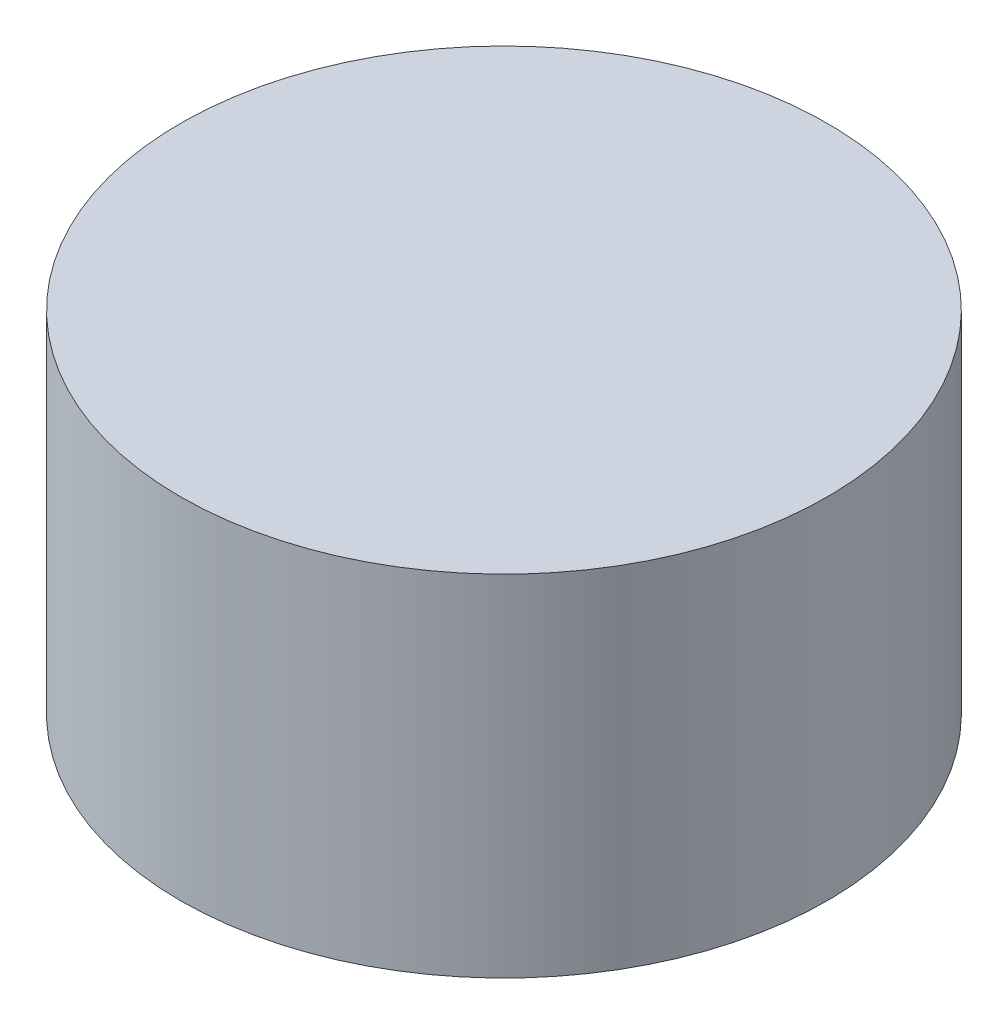
ISO-10303-21;
HEADER;
FILE_DESCRIPTION(('STEP AP214'),'2;1');
FILE_NAME('part.step','',(''),(''),'','','');
FILE_SCHEMA(('AUTOMOTIVE_DESIGN { 1 0 10303 214 1 1 1 1 }'));
ENDSEC;
DATA;
#1=APPLICATION_CONTEXT('core data for automotive mechanical design processes');
#2=APPLICATION_PROTOCOL_DEFINITION('international standard','automotive_design',2000,#1);
#3=PRODUCT_CONTEXT('',#1,'mechanical');
#4=PRODUCT('Part','Part','',(#3));
#5=PRODUCT_RELATED_PRODUCT_CATEGORY('part','',(#4));
#6=PRODUCT_DEFINITION_FORMATION('','',#4);
#7=PRODUCT_DEFINITION_CONTEXT('part definition',#1,'design');
#8=PRODUCT_DEFINITION('design','',#6,#7);
#9=PRODUCT_DEFINITION_SHAPE('','',#8);
#10=(LENGTH_UNIT() NAMED_UNIT(*) SI_UNIT(.MILLI.,.METRE.));
#11=(NAMED_UNIT(*) PLANE_ANGLE_UNIT() SI_UNIT($,.RADIAN.));
#12=(NAMED_UNIT(*) SI_UNIT($,.STERADIAN.) SOLID_ANGLE_UNIT());
#13=UNCERTAINTY_MEASURE_WITH_UNIT(LENGTH_MEASURE(1.E-05),#10,'distance_accuracy_value','');
#14=(GEOMETRIC_REPRESENTATION_CONTEXT(3) GLOBAL_UNCERTAINTY_ASSIGNED_CONTEXT((#13)) GLOBAL_UNIT_ASSIGNED_CONTEXT((#10,
#11,#12)) REPRESENTATION_CONTEXT('',''));
#15=CARTESIAN_POINT('',(0.,0.,0.));
#16=DIRECTION('',(0.,0.,1.));
#17=DIRECTION('',(1.,0.,0.));
#18=AXIS2_PLACEMENT_3D('',#15,#16,#17);
#19=CARTESIAN_POINT('',(0.,1.8542,0.));
#20=DIRECTION('',(0.,-1.,0.));
#21=DIRECTION('',(0.,0.,-1.));
#22=AXIS2_PLACEMENT_3D('',#19,#20,#21);
#23=CYLINDRICAL_SURFACE('',#22,1.7145);
#24=CARTESIAN_POINT('',(0.,1.8542,0.));
#25=DIRECTION('',(0.,1.,0.));
#26=DIRECTION('',(0.,0.,1.));
#27=AXIS2_PLACEMENT_3D('',#24,#25,#26);
#28=CIRCLE('',#27,1.7145);
#29=CARTESIAN_POINT('',(0.,1.8542,1.7145));
#30=VERTEX_POINT('',#29);
#31=EDGE_CURVE('E10',#30,#30,#28,.T.);
#32=ORIENTED_EDGE('',*,*,#31,.F.);
#33=EDGE_LOOP('',(#32));
#34=FACE_BOUND('',#33,.T.);
#35=CARTESIAN_POINT('',(0.,0.,0.));
#36=DIRECTION('',(0.,1.,0.));
#37=DIRECTION('',(0.,0.,1.));
#38=AXIS2_PLACEMENT_3D('',#35,#36,#37);
#39=CIRCLE('',#38,1.7145);
#40=CARTESIAN_POINT('',(0.,0.,1.7145));
#41=VERTEX_POINT('',#40);
#42=EDGE_CURVE('E36',#41,#41,#39,.T.);
#43=ORIENTED_EDGE('',*,*,#42,.T.);
#44=EDGE_LOOP('',(#43));
#45=FACE_BOUND('',#44,.T.);
#46=ADVANCED_FACE('F33',(#34,#45),#23,.T.);
#47=CARTESIAN_POINT('',(0.,1.8542,0.));
#48=DIRECTION('',(0.,1.,0.));
#49=DIRECTION('',(0.,0.,1.));
#50=AXIS2_PLACEMENT_3D('',#47,#48,#49);
#51=PLANE('',#50);
#52=ORIENTED_EDGE('',*,*,#31,.T.);
#53=EDGE_LOOP('',(#52));
#54=FACE_BOUND('',#53,.T.);
#55=ADVANCED_FACE('F48',(#54),#51,.T.);
#56=CARTESIAN_POINT('',(0.,0.,0.));
#57=DIRECTION('',(0.,1.,0.));
#58=DIRECTION('',(0.,0.,1.));
#59=AXIS2_PLACEMENT_3D('',#56,#57,#58);
#60=PLANE('',#59);
#61=ORIENTED_EDGE('',*,*,#42,.F.);
#62=EDGE_LOOP('',(#61));
#63=FACE_BOUND('',#62,.T.);
#64=ADVANCED_FACE('F46',(#63),#60,.F.);
#65=CLOSED_SHELL('',(#46,#55,#64));
#66=MANIFOLD_SOLID_BREP('B2',#65);
#67=ADVANCED_BREP_SHAPE_REPRESENTATION('',(#18,#66),#14);
#68=SHAPE_DEFINITION_REPRESENTATION(#9,#67);
ENDSEC;
END-ISO-10303-21;
